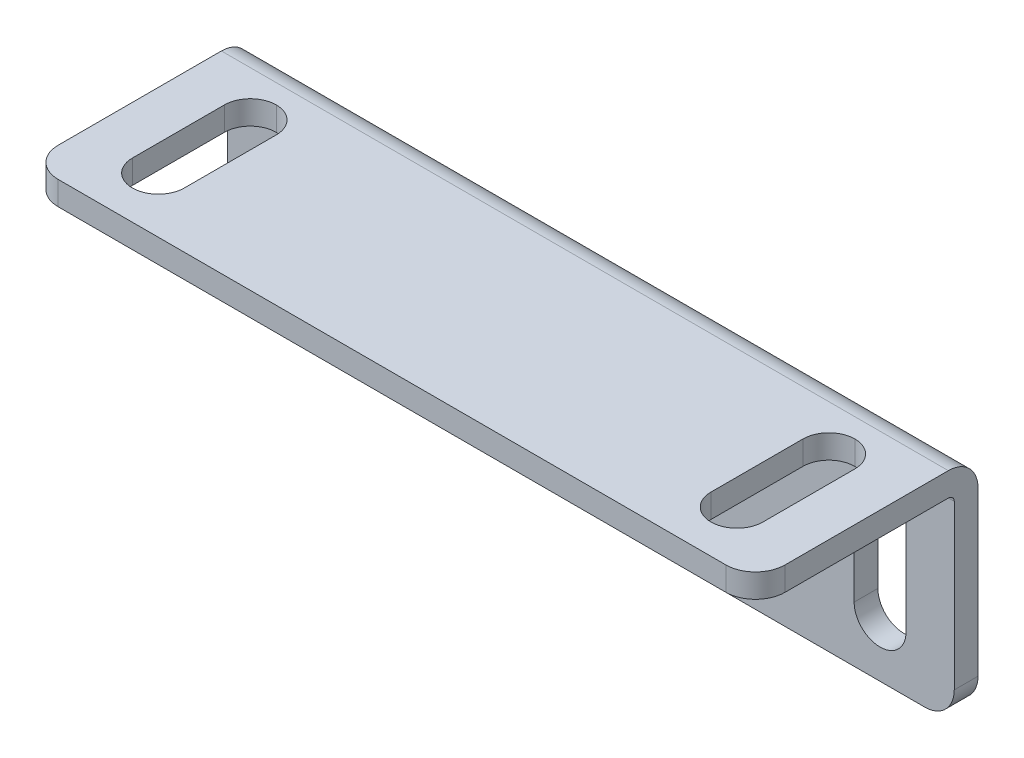
ISO-10303-21;
HEADER;
FILE_DESCRIPTION(('STEP AP214'),'2;1');
FILE_NAME('part.step','',(''),(''),'','','');
FILE_SCHEMA(('AUTOMOTIVE_DESIGN { 1 0 10303 214 1 1 1 1 }'));
ENDSEC;
DATA;
#1=APPLICATION_CONTEXT('core data for automotive mechanical design processes');
#2=APPLICATION_PROTOCOL_DEFINITION('international standard','automotive_design',2000,#1);
#3=PRODUCT_CONTEXT('',#1,'mechanical');
#4=PRODUCT('Part','Part','',(#3));
#5=PRODUCT_RELATED_PRODUCT_CATEGORY('part','',(#4));
#6=PRODUCT_DEFINITION_FORMATION('','',#4);
#7=PRODUCT_DEFINITION_CONTEXT('part definition',#1,'design');
#8=PRODUCT_DEFINITION('design','',#6,#7);
#9=PRODUCT_DEFINITION_SHAPE('','',#8);
#10=(LENGTH_UNIT() NAMED_UNIT(*) SI_UNIT(.MILLI.,.METRE.));
#11=(NAMED_UNIT(*) PLANE_ANGLE_UNIT() SI_UNIT($,.RADIAN.));
#12=(NAMED_UNIT(*) SI_UNIT($,.STERADIAN.) SOLID_ANGLE_UNIT());
#13=UNCERTAINTY_MEASURE_WITH_UNIT(LENGTH_MEASURE(1.E-05),#10,'distance_accuracy_value','');
#14=(GEOMETRIC_REPRESENTATION_CONTEXT(3) GLOBAL_UNCERTAINTY_ASSIGNED_CONTEXT((#13)) GLOBAL_UNIT_ASSIGNED_CONTEXT((#10,
#11,#12)) REPRESENTATION_CONTEXT('',''));
#15=CARTESIAN_POINT('',(0.,0.,0.));
#16=DIRECTION('',(0.,0.,1.));
#17=DIRECTION('',(1.,0.,0.));
#18=AXIS2_PLACEMENT_3D('',#15,#16,#17);
#19=CARTESIAN_POINT('',(-19.5,7.5,5.05));
#20=DIRECTION('',(0.,-1.,0.));
#21=DIRECTION('',(0.,0.,-1.));
#22=AXIS2_PLACEMENT_3D('',#19,#20,#21);
#23=CYLINDRICAL_SURFACE('',#22,1.75000000000005);
#24=CARTESIAN_POINT('',(-19.5,7.5,5.05));
#25=DIRECTION('',(0.,-1.,0.));
#26=DIRECTION('',(0.,0.,-1.));
#27=AXIS2_PLACEMENT_3D('',#24,#25,#26);
#28=CIRCLE('',#27,1.75000000000005);
#29=CARTESIAN_POINT('',(-19.5,7.5,3.29999999999996));
#30=VERTEX_POINT('',#29);
#31=CARTESIAN_POINT('',(-17.75,7.5,5.05));
#32=VERTEX_POINT('',#31);
#33=EDGE_CURVE('E41',#30,#32,#28,.T.);
#34=ORIENTED_EDGE('',*,*,#33,.F.);
#35=DIRECTION('',(0.,-1.,0.));
#36=VECTOR('',#35,1.);
#37=CARTESIAN_POINT('',(-19.5,7.5,3.29999999999996));
#38=LINE('',#37,#36);
#39=CARTESIAN_POINT('',(-19.5,5.9,3.29999999999996));
#40=VERTEX_POINT('',#39);
#41=EDGE_CURVE('E11',#30,#40,#38,.T.);
#42=ORIENTED_EDGE('',*,*,#41,.T.);
#43=CARTESIAN_POINT('',(-19.5,5.9,5.05));
#44=DIRECTION('',(0.,-1.,0.));
#45=DIRECTION('',(0.,0.,-1.));
#46=AXIS2_PLACEMENT_3D('',#43,#44,#45);
#47=CIRCLE('',#46,1.75000000000005);
#48=CARTESIAN_POINT('',(-17.75,5.9,5.05));
#49=VERTEX_POINT('',#48);
#50=EDGE_CURVE('E27',#40,#49,#47,.T.);
#51=ORIENTED_EDGE('',*,*,#50,.T.);
#52=DIRECTION('',(0.,-1.,0.));
#53=VECTOR('',#52,1.);
#54=CARTESIAN_POINT('',(-17.75,7.5,5.05));
#55=LINE('',#54,#53);
#56=EDGE_CURVE('E452',#32,#49,#55,.T.);
#57=ORIENTED_EDGE('',*,*,#56,.F.);
#58=EDGE_LOOP('',(#34,#42,#51,#57));
#59=FACE_BOUND('',#58,.T.);
#60=ADVANCED_FACE('F16',(#59),#23,.F.);
#61=CARTESIAN_POINT('',(19.5,7.5,5.05));
#62=DIRECTION('',(0.,-1.,0.));
#63=DIRECTION('',(0.,0.,-1.));
#64=AXIS2_PLACEMENT_3D('',#61,#62,#63);
#65=CYLINDRICAL_SURFACE('',#64,1.75000000000005);
#66=CARTESIAN_POINT('',(19.5,7.5,5.05));
#67=DIRECTION('',(0.,-1.,0.));
#68=DIRECTION('',(0.,0.,1.));
#69=AXIS2_PLACEMENT_3D('',#66,#67,#68);
#70=CIRCLE('',#69,1.75000000000005);
#71=CARTESIAN_POINT('',(19.5,7.5,3.29999999999996));
#72=VERTEX_POINT('',#71);
#73=CARTESIAN_POINT('',(21.25,7.5,5.05));
#74=VERTEX_POINT('',#73);
#75=EDGE_CURVE('E290',#72,#74,#70,.T.);
#76=ORIENTED_EDGE('',*,*,#75,.F.);
#77=DIRECTION('',(0.,-1.,0.));
#78=VECTOR('',#77,1.);
#79=CARTESIAN_POINT('',(19.5,7.5,3.29999999999996));
#80=LINE('',#79,#78);
#81=CARTESIAN_POINT('',(19.5,5.9,3.29999999999996));
#82=VERTEX_POINT('',#81);
#83=EDGE_CURVE('E285',#72,#82,#80,.T.);
#84=ORIENTED_EDGE('',*,*,#83,.T.);
#85=CARTESIAN_POINT('',(19.5,5.9,5.05));
#86=DIRECTION('',(0.,-1.,0.));
#87=DIRECTION('',(0.,0.,1.));
#88=AXIS2_PLACEMENT_3D('',#85,#86,#87);
#89=CIRCLE('',#88,1.75000000000005);
#90=CARTESIAN_POINT('',(21.25,5.9,5.05));
#91=VERTEX_POINT('',#90);
#92=EDGE_CURVE('E492',#82,#91,#89,.T.);
#93=ORIENTED_EDGE('',*,*,#92,.T.);
#94=DIRECTION('',(0.,-1.,0.));
#95=VECTOR('',#94,1.);
#96=CARTESIAN_POINT('',(21.25,7.5,5.05));
#97=LINE('',#96,#95);
#98=EDGE_CURVE('E305',#74,#91,#97,.T.);
#99=ORIENTED_EDGE('',*,*,#98,.F.);
#100=EDGE_LOOP('',(#76,#84,#93,#99));
#101=FACE_BOUND('',#100,.T.);
#102=ADVANCED_FACE('F637',(#101),#65,.F.);
#103=CARTESIAN_POINT('',(0.,0.,1.6));
#104=DIRECTION('',(0.,0.,-1.));
#105=DIRECTION('',(0.,-1.,0.));
#106=AXIS2_PLACEMENT_3D('',#103,#104,#105);
#107=PLANE('',#106);
#108=DIRECTION('',(0.,-1.,0.));
#109=VECTOR('',#108,1.);
#110=CARTESIAN_POINT('',(-24.5,-7.5,1.6));
#111=LINE('',#110,#109);
#112=CARTESIAN_POINT('',(-24.5,5.5,1.6));
#113=VERTEX_POINT('',#112);
#114=CARTESIAN_POINT('',(-24.5,-5.5,1.6));
#115=VERTEX_POINT('',#114);
#116=EDGE_CURVE('E341',#113,#115,#111,.T.);
#117=ORIENTED_EDGE('',*,*,#116,.T.);
#118=CARTESIAN_POINT('',(-22.5,-5.5,1.6));
#119=DIRECTION('',(0.,0.,1.));
#120=DIRECTION('',(-1.,0.,0.));
#121=AXIS2_PLACEMENT_3D('',#118,#119,#120);
#122=CIRCLE('',#121,2.);
#123=CARTESIAN_POINT('',(-22.5,-7.5,1.6));
#124=VERTEX_POINT('',#123);
#125=EDGE_CURVE('E337',#115,#124,#122,.T.);
#126=ORIENTED_EDGE('',*,*,#125,.T.);
#127=DIRECTION('',(1.,0.,0.));
#128=VECTOR('',#127,1.);
#129=CARTESIAN_POINT('',(-24.5,-7.5,1.6));
#130=LINE('',#129,#128);
#131=CARTESIAN_POINT('',(22.5,-7.5,1.6));
#132=VERTEX_POINT('',#131);
#133=EDGE_CURVE('E342',#124,#132,#130,.T.);
#134=ORIENTED_EDGE('',*,*,#133,.T.);
#135=CARTESIAN_POINT('',(22.5,-5.5,1.6));
#136=DIRECTION('',(0.,0.,1.));
#137=DIRECTION('',(-1.,0.,0.));
#138=AXIS2_PLACEMENT_3D('',#135,#136,#137);
#139=CIRCLE('',#138,2.);
#140=CARTESIAN_POINT('',(24.5,-5.5,1.6));
#141=VERTEX_POINT('',#140);
#142=EDGE_CURVE('E443',#132,#141,#139,.T.);
#143=ORIENTED_EDGE('',*,*,#142,.T.);
#144=DIRECTION('',(0.,1.,0.));
#145=VECTOR('',#144,1.);
#146=CARTESIAN_POINT('',(24.5,-7.5,1.6));
#147=LINE('',#146,#145);
#148=CARTESIAN_POINT('',(24.5,5.5,1.6));
#149=VERTEX_POINT('',#148);
#150=EDGE_CURVE('E447',#141,#149,#147,.T.);
#151=ORIENTED_EDGE('',*,*,#150,.T.);
#152=DIRECTION('',(-1.,0.,0.));
#153=VECTOR('',#152,1.);
#154=CARTESIAN_POINT('',(-24.5,5.5,1.6));
#155=LINE('',#154,#153);
#156=EDGE_CURVE('E451',#149,#113,#155,.T.);
#157=ORIENTED_EDGE('',*,*,#156,.T.);
#158=EDGE_LOOP('',(#117,#126,#134,#143,#151,#157));
#159=FACE_BOUND('',#158,.T.);
#160=DIRECTION('',(0.,-1.,0.));
#161=VECTOR('',#160,1.);
#162=CARTESIAN_POINT('',(-21.25,2.45,1.6));
#163=LINE('',#162,#161);
#164=CARTESIAN_POINT('',(-21.25,2.45,1.6));
#165=VERTEX_POINT('',#164);
#166=CARTESIAN_POINT('',(-21.25,-3.75,1.6));
#167=VERTEX_POINT('',#166);
#168=EDGE_CURVE('E367',#165,#167,#163,.T.);
#169=ORIENTED_EDGE('',*,*,#168,.F.);
#170=CARTESIAN_POINT('',(-19.5,2.45,1.6));
#171=DIRECTION('',(0.,0.,1.));
#172=DIRECTION('',(1.,0.,0.));
#173=AXIS2_PLACEMENT_3D('',#170,#171,#172);
#174=CIRCLE('',#173,1.75);
#175=CARTESIAN_POINT('',(-17.75,2.45,1.6));
#176=VERTEX_POINT('',#175);
#177=EDGE_CURVE('E330',#176,#165,#174,.T.);
#178=ORIENTED_EDGE('',*,*,#177,.F.);
#179=DIRECTION('',(0.,1.,0.));
#180=VECTOR('',#179,1.);
#181=CARTESIAN_POINT('',(-17.75,2.45,1.6));
#182=LINE('',#181,#180);
#183=CARTESIAN_POINT('',(-17.75,-3.75,1.6));
#184=VERTEX_POINT('',#183);
#185=EDGE_CURVE('E362',#184,#176,#182,.T.);
#186=ORIENTED_EDGE('',*,*,#185,.F.);
#187=CARTESIAN_POINT('',(-19.5,-3.75,1.6));
#188=DIRECTION('',(0.,0.,1.));
#189=DIRECTION('',(1.,0.,0.));
#190=AXIS2_PLACEMENT_3D('',#187,#188,#189);
#191=CIRCLE('',#190,1.75);
#192=EDGE_CURVE('E468',#167,#184,#191,.T.);
#193=ORIENTED_EDGE('',*,*,#192,.F.);
#194=EDGE_LOOP('',(#169,#178,#186,#193));
#195=FACE_BOUND('',#194,.T.);
#196=DIRECTION('',(0.,-1.,0.));
#197=VECTOR('',#196,1.);
#198=CARTESIAN_POINT('',(17.75,2.45,1.6));
#199=LINE('',#198,#197);
#200=CARTESIAN_POINT('',(17.75,2.45,1.6));
#201=VERTEX_POINT('',#200);
#202=CARTESIAN_POINT('',(17.75,-3.75000000000016,1.6));
#203=VERTEX_POINT('',#202);
#204=EDGE_CURVE('E329',#201,#203,#199,.T.);
#205=ORIENTED_EDGE('',*,*,#204,.F.);
#206=CARTESIAN_POINT('',(19.5,2.45,1.6));
#207=DIRECTION('',(0.,0.,1.));
#208=DIRECTION('',(-1.,0.,0.));
#209=AXIS2_PLACEMENT_3D('',#206,#207,#208);
#210=CIRCLE('',#209,1.75);
#211=CARTESIAN_POINT('',(21.25,2.45,1.6));
#212=VERTEX_POINT('',#211);
#213=EDGE_CURVE('E413',#212,#201,#210,.T.);
#214=ORIENTED_EDGE('',*,*,#213,.F.);
#215=DIRECTION('',(0.,1.,0.));
#216=VECTOR('',#215,1.);
#217=CARTESIAN_POINT('',(21.25,2.45,1.6));
#218=LINE('',#217,#216);
#219=CARTESIAN_POINT('',(21.25,-3.75000000000019,1.6));
#220=VERTEX_POINT('',#219);
#221=EDGE_CURVE('E403',#220,#212,#218,.T.);
#222=ORIENTED_EDGE('',*,*,#221,.F.);
#223=CARTESIAN_POINT('',(19.5,-3.75000000000018,1.6));
#224=DIRECTION('',(0.,0.,1.));
#225=DIRECTION('',(-1.,0.,0.));
#226=AXIS2_PLACEMENT_3D('',#223,#224,#225);
#227=CIRCLE('',#226,1.75);
#228=EDGE_CURVE('E383',#203,#220,#227,.T.);
#229=ORIENTED_EDGE('',*,*,#228,.F.);
#230=EDGE_LOOP('',(#205,#214,#222,#229));
#231=FACE_BOUND('',#230,.T.);
#232=ADVANCED_FACE('F613',(#159,#195,#231),#107,.F.);
#233=CARTESIAN_POINT('',(24.5,-7.5,1.6));
#234=DIRECTION('',(-1.,0.,0.));
#235=DIRECTION('',(0.,0.,1.));
#236=AXIS2_PLACEMENT_3D('',#233,#234,#235);
#237=PLANE('',#236);
#238=DIRECTION('',(0.,0.,-1.));
#239=VECTOR('',#238,1.);
#240=CARTESIAN_POINT('',(24.5,7.5,1.6));
#241=LINE('',#240,#239);
#242=CARTESIAN_POINT('',(24.5,7.5,13.));
#243=VERTEX_POINT('',#242);
#244=CARTESIAN_POINT('',(24.5,7.5,2.));
#245=VERTEX_POINT('',#244);
#246=EDGE_CURVE('E352',#243,#245,#241,.T.);
#247=ORIENTED_EDGE('',*,*,#246,.F.);
#248=DIRECTION('',(0.,-1.,0.));
#249=VECTOR('',#248,1.);
#250=CARTESIAN_POINT('',(24.5,5.9,13.));
#251=LINE('',#250,#249);
#252=CARTESIAN_POINT('',(24.5,5.9,13.));
#253=VERTEX_POINT('',#252);
#254=EDGE_CURVE('E499',#243,#253,#251,.T.);
#255=ORIENTED_EDGE('',*,*,#254,.T.);
#256=DIRECTION('',(0.,0.,-1.));
#257=VECTOR('',#256,1.);
#258=CARTESIAN_POINT('',(24.5,5.9,0.));
#259=LINE('',#258,#257);
#260=CARTESIAN_POINT('',(24.5,5.9,2.));
#261=VERTEX_POINT('',#260);
#262=EDGE_CURVE('E335',#253,#261,#259,.T.);
#263=ORIENTED_EDGE('',*,*,#262,.T.);
#264=CARTESIAN_POINT('',(24.5,5.5,2.));
#265=DIRECTION('',(-1.,0.,0.));
#266=DIRECTION('',(0.,0.,1.));
#267=AXIS2_PLACEMENT_3D('',#264,#265,#266);
#268=CIRCLE('',#267,0.4);
#269=EDGE_CURVE('E331',#261,#149,#268,.T.);
#270=ORIENTED_EDGE('',*,*,#269,.T.);
#271=ORIENTED_EDGE('',*,*,#150,.F.);
#272=DIRECTION('',(0.,0.,-1.));
#273=VECTOR('',#272,1.);
#274=CARTESIAN_POINT('',(24.5,-5.5,1.6));
#275=LINE('',#274,#273);
#276=CARTESIAN_POINT('',(24.5,-5.5,0.));
#277=VERTEX_POINT('',#276);
#278=EDGE_CURVE('E336',#141,#277,#275,.T.);
#279=ORIENTED_EDGE('',*,*,#278,.T.);
#280=DIRECTION('',(0.,1.,0.));
#281=VECTOR('',#280,1.);
#282=CARTESIAN_POINT('',(24.5,-7.5,0.));
#283=LINE('',#282,#281);
#284=CARTESIAN_POINT('',(24.5,5.5,0.));
#285=VERTEX_POINT('',#284);
#286=EDGE_CURVE('E346',#277,#285,#283,.T.);
#287=ORIENTED_EDGE('',*,*,#286,.T.);
#288=CARTESIAN_POINT('',(24.5,5.5,2.));
#289=DIRECTION('',(1.,0.,0.));
#290=DIRECTION('',(0.,0.,1.));
#291=AXIS2_PLACEMENT_3D('',#288,#289,#290);
#292=CIRCLE('',#291,2.);
#293=EDGE_CURVE('E387',#285,#245,#292,.T.);
#294=ORIENTED_EDGE('',*,*,#293,.T.);
#295=EDGE_LOOP('',(#247,#255,#263,#270,#271,#279,#287,#294));
#296=FACE_BOUND('',#295,.T.);
#297=ADVANCED_FACE('F670',(#296),#237,.F.);
#298=CARTESIAN_POINT('',(-24.5,7.5,1.6));
#299=DIRECTION('',(0.,-1.,0.));
#300=DIRECTION('',(0.,0.,-1.));
#301=AXIS2_PLACEMENT_3D('',#298,#299,#300);
#302=PLANE('',#301);
#303=DIRECTION('',(1.,0.,0.));
#304=VECTOR('',#303,1.);
#305=CARTESIAN_POINT('',(-24.5,7.5,15.));
#306=LINE('',#305,#304);
#307=CARTESIAN_POINT('',(-22.5,7.5,15.));
#308=VERTEX_POINT('',#307);
#309=CARTESIAN_POINT('',(22.5,7.5,15.));
#310=VERTEX_POINT('',#309);
#311=EDGE_CURVE('E351',#308,#310,#306,.T.);
#312=ORIENTED_EDGE('',*,*,#311,.T.);
#313=CARTESIAN_POINT('',(22.5,7.5,13.));
#314=DIRECTION('',(0.,1.,0.));
#315=DIRECTION('',(0.,0.,-1.));
#316=AXIS2_PLACEMENT_3D('',#313,#314,#315);
#317=CIRCLE('',#316,2.);
#318=EDGE_CURVE('E347',#310,#243,#317,.T.);
#319=ORIENTED_EDGE('',*,*,#318,.T.);
#320=ORIENTED_EDGE('',*,*,#246,.T.);
#321=DIRECTION('',(-1.,0.,0.));
#322=VECTOR('',#321,1.);
#323=CARTESIAN_POINT('',(-24.5,7.5,2.));
#324=LINE('',#323,#322);
#325=CARTESIAN_POINT('',(-24.5,7.5,2.));
#326=VERTEX_POINT('',#325);
#327=EDGE_CURVE('E361',#245,#326,#324,.T.);
#328=ORIENTED_EDGE('',*,*,#327,.T.);
#329=DIRECTION('',(0.,0.,-1.));
#330=VECTOR('',#329,1.);
#331=CARTESIAN_POINT('',(-24.5,7.5,1.6));
#332=LINE('',#331,#330);
#333=CARTESIAN_POINT('',(-24.5,7.5,13.));
#334=VERTEX_POINT('',#333);
#335=EDGE_CURVE('E496',#334,#326,#332,.T.);
#336=ORIENTED_EDGE('',*,*,#335,.F.);
#337=CARTESIAN_POINT('',(-22.5,7.5,13.));
#338=DIRECTION('',(0.,1.,0.));
#339=DIRECTION('',(0.,0.,-1.));
#340=AXIS2_PLACEMENT_3D('',#337,#338,#339);
#341=CIRCLE('',#340,2.);
#342=EDGE_CURVE('E461',#334,#308,#341,.T.);
#343=ORIENTED_EDGE('',*,*,#342,.T.);
#344=EDGE_LOOP('',(#312,#319,#320,#328,#336,#343));
#345=FACE_BOUND('',#344,.T.);
#346=DIRECTION('',(0.,0.,1.));
#347=VECTOR('',#346,1.);
#348=CARTESIAN_POINT('',(-17.75,7.5,11.25));
#349=LINE('',#348,#347);
#350=CARTESIAN_POINT('',(-17.75,7.5,11.25));
#351=VERTEX_POINT('',#350);
#352=EDGE_CURVE('E457',#32,#351,#349,.T.);
#353=ORIENTED_EDGE('',*,*,#352,.T.);
#354=CARTESIAN_POINT('',(-19.5,7.5,11.25));
#355=DIRECTION('',(0.,-1.,0.));
#356=DIRECTION('',(0.,0.,-1.));
#357=AXIS2_PLACEMENT_3D('',#354,#355,#356);
#358=CIRCLE('',#357,1.75);
#359=CARTESIAN_POINT('',(-21.25,7.5,11.25));
#360=VERTEX_POINT('',#359);
#361=EDGE_CURVE('E357',#351,#360,#358,.T.);
#362=ORIENTED_EDGE('',*,*,#361,.T.);
#363=DIRECTION('',(0.,0.,-1.));
#364=VECTOR('',#363,1.);
#365=CARTESIAN_POINT('',(-21.25,7.5,11.25));
#366=LINE('',#365,#364);
#367=CARTESIAN_POINT('',(-21.25,7.5,5.05));
#368=VERTEX_POINT('',#367);
#369=EDGE_CURVE('E353',#360,#368,#366,.T.);
#370=ORIENTED_EDGE('',*,*,#369,.T.);
#371=CARTESIAN_POINT('',(-19.5,7.5,5.05));
#372=DIRECTION('',(0.,-1.,0.));
#373=DIRECTION('',(0.,0.,-1.));
#374=AXIS2_PLACEMENT_3D('',#371,#372,#373);
#375=CIRCLE('',#374,1.75000000000005);
#376=EDGE_CURVE('E358',#368,#30,#375,.T.);
#377=ORIENTED_EDGE('',*,*,#376,.T.);
#378=ORIENTED_EDGE('',*,*,#33,.T.);
#379=EDGE_LOOP('',(#353,#362,#370,#377,#378));
#380=FACE_BOUND('',#379,.T.);
#381=DIRECTION('',(0.,0.,1.));
#382=VECTOR('',#381,1.);
#383=CARTESIAN_POINT('',(21.25,7.5,11.25));
#384=LINE('',#383,#382);
#385=CARTESIAN_POINT('',(21.25,7.5,11.25));
#386=VERTEX_POINT('',#385);
#387=EDGE_CURVE('E557',#74,#386,#384,.T.);
#388=ORIENTED_EDGE('',*,*,#387,.T.);
#389=CARTESIAN_POINT('',(19.5,7.5,11.25));
#390=DIRECTION('',(0.,-1.,0.));
#391=DIRECTION('',(0.,0.,1.));
#392=AXIS2_PLACEMENT_3D('',#389,#390,#391);
#393=CIRCLE('',#392,1.75);
#394=CARTESIAN_POINT('',(17.75,7.5,11.25));
#395=VERTEX_POINT('',#394);
#396=EDGE_CURVE('E295',#386,#395,#393,.T.);
#397=ORIENTED_EDGE('',*,*,#396,.T.);
#398=DIRECTION('',(0.,0.,-1.));
#399=VECTOR('',#398,1.);
#400=CARTESIAN_POINT('',(17.75,7.5,11.25));
#401=LINE('',#400,#399);
#402=CARTESIAN_POINT('',(17.75,7.5,5.05));
#403=VERTEX_POINT('',#402);
#404=EDGE_CURVE('E289',#395,#403,#401,.T.);
#405=ORIENTED_EDGE('',*,*,#404,.T.);
#406=CARTESIAN_POINT('',(19.5,7.5,5.05));
#407=DIRECTION('',(0.,-1.,0.));
#408=DIRECTION('',(0.,0.,1.));
#409=AXIS2_PLACEMENT_3D('',#406,#407,#408);
#410=CIRCLE('',#409,1.75000000000005);
#411=EDGE_CURVE('E278',#403,#72,#410,.T.);
#412=ORIENTED_EDGE('',*,*,#411,.T.);
#413=ORIENTED_EDGE('',*,*,#75,.T.);
#414=EDGE_LOOP('',(#388,#397,#405,#412,#413));
#415=FACE_BOUND('',#414,.T.);
#416=ADVANCED_FACE('F294',(#345,#380,#415),#302,.F.);
#417=CARTESIAN_POINT('',(-24.5,-7.5,1.6));
#418=DIRECTION('',(1.,0.,0.));
#419=DIRECTION('',(0.,1.,0.));
#420=AXIS2_PLACEMENT_3D('',#417,#418,#419);
#421=PLANE('',#420);
#422=DIRECTION('',(0.,0.,1.));
#423=VECTOR('',#422,1.);
#424=CARTESIAN_POINT('',(-24.5,5.9,0.));
#425=LINE('',#424,#423);
#426=CARTESIAN_POINT('',(-24.5,5.9,2.));
#427=VERTEX_POINT('',#426);
#428=CARTESIAN_POINT('',(-24.5,5.9,13.));
#429=VERTEX_POINT('',#428);
#430=EDGE_CURVE('E418',#427,#429,#425,.T.);
#431=ORIENTED_EDGE('',*,*,#430,.T.);
#432=DIRECTION('',(0.,1.,0.));
#433=VECTOR('',#432,1.);
#434=CARTESIAN_POINT('',(-24.5,7.5,13.));
#435=LINE('',#434,#433);
#436=EDGE_CURVE('E422',#429,#334,#435,.T.);
#437=ORIENTED_EDGE('',*,*,#436,.T.);
#438=ORIENTED_EDGE('',*,*,#335,.T.);
#439=CARTESIAN_POINT('',(-24.5,5.5,2.));
#440=DIRECTION('',(-1.,0.,0.));
#441=DIRECTION('',(0.,0.,-1.));
#442=AXIS2_PLACEMENT_3D('',#439,#440,#441);
#443=CIRCLE('',#442,2.);
#444=CARTESIAN_POINT('',(-24.5,5.5,0.));
#445=VERTEX_POINT('',#444);
#446=EDGE_CURVE('E441',#326,#445,#443,.T.);
#447=ORIENTED_EDGE('',*,*,#446,.T.);
#448=DIRECTION('',(0.,-1.,0.));
#449=VECTOR('',#448,1.);
#450=CARTESIAN_POINT('',(-24.5,-7.5,0.));
#451=LINE('',#450,#449);
#452=CARTESIAN_POINT('',(-24.5,-5.5,0.));
#453=VERTEX_POINT('',#452);
#454=EDGE_CURVE('E397',#445,#453,#451,.T.);
#455=ORIENTED_EDGE('',*,*,#454,.T.);
#456=DIRECTION('',(0.,0.,1.));
#457=VECTOR('',#456,1.);
#458=CARTESIAN_POINT('',(-24.5,-5.5,1.6));
#459=LINE('',#458,#457);
#460=EDGE_CURVE('E393',#453,#115,#459,.T.);
#461=ORIENTED_EDGE('',*,*,#460,.T.);
#462=ORIENTED_EDGE('',*,*,#116,.F.);
#463=CARTESIAN_POINT('',(-24.5,5.5,2.));
#464=DIRECTION('',(1.,0.,0.));
#465=DIRECTION('',(0.,0.,-1.));
#466=AXIS2_PLACEMENT_3D('',#463,#464,#465);
#467=CIRCLE('',#466,0.4);
#468=EDGE_CURVE('E398',#113,#427,#467,.T.);
#469=ORIENTED_EDGE('',*,*,#468,.T.);
#470=EDGE_LOOP('',(#431,#437,#438,#447,#455,#461,#462,#469));
#471=FACE_BOUND('',#470,.T.);
#472=ADVANCED_FACE('F668',(#471),#421,.F.);
#473=CARTESIAN_POINT('',(-24.5,-7.5,1.6));
#474=DIRECTION('',(0.,1.,0.));
#475=DIRECTION('',(1.,0.,0.));
#476=AXIS2_PLACEMENT_3D('',#473,#474,#475);
#477=PLANE('',#476);
#478=ORIENTED_EDGE('',*,*,#133,.F.);
#479=DIRECTION('',(0.,0.,-1.));
#480=VECTOR('',#479,1.);
#481=CARTESIAN_POINT('',(-22.5,-7.5,1.6));
#482=LINE('',#481,#480);
#483=CARTESIAN_POINT('',(-22.5,-7.5,0.));
#484=VERTEX_POINT('',#483);
#485=EDGE_CURVE('E402',#124,#484,#482,.T.);
#486=ORIENTED_EDGE('',*,*,#485,.T.);
#487=DIRECTION('',(1.,0.,0.));
#488=VECTOR('',#487,1.);
#489=CARTESIAN_POINT('',(-24.5,-7.5,0.));
#490=LINE('',#489,#488);
#491=CARTESIAN_POINT('',(22.5,-7.5,0.));
#492=VERTEX_POINT('',#491);
#493=EDGE_CURVE('E375',#484,#492,#490,.T.);
#494=ORIENTED_EDGE('',*,*,#493,.T.);
#495=DIRECTION('',(0.,0.,1.));
#496=VECTOR('',#495,1.);
#497=CARTESIAN_POINT('',(22.5,-7.5,1.6));
#498=LINE('',#497,#496);
#499=EDGE_CURVE('E371',#492,#132,#498,.T.);
#500=ORIENTED_EDGE('',*,*,#499,.T.);
#501=EDGE_LOOP('',(#478,#486,#494,#500));
#502=FACE_BOUND('',#501,.T.);
#503=ADVANCED_FACE('F665',(#502),#477,.F.);
#504=CARTESIAN_POINT('',(0.,0.,0.));
#505=DIRECTION('',(0.,0.,-1.));
#506=DIRECTION('',(0.,-1.,0.));
#507=AXIS2_PLACEMENT_3D('',#504,#505,#506);
#508=PLANE('',#507);
#509=ORIENTED_EDGE('',*,*,#493,.F.);
#510=CARTESIAN_POINT('',(-22.5,-5.5,0.));
#511=DIRECTION('',(0.,0.,-1.));
#512=DIRECTION('',(-1.,0.,0.));
#513=AXIS2_PLACEMENT_3D('',#510,#511,#512);
#514=CIRCLE('',#513,2.);
#515=EDGE_CURVE('E323',#484,#453,#514,.T.);
#516=ORIENTED_EDGE('',*,*,#515,.T.);
#517=ORIENTED_EDGE('',*,*,#454,.F.);
#518=DIRECTION('',(1.,0.,0.));
#519=VECTOR('',#518,1.);
#520=CARTESIAN_POINT('',(24.5,5.5,0.));
#521=LINE('',#520,#519);
#522=EDGE_CURVE('E319',#445,#285,#521,.T.);
#523=ORIENTED_EDGE('',*,*,#522,.T.);
#524=ORIENTED_EDGE('',*,*,#286,.F.);
#525=CARTESIAN_POINT('',(22.5,-5.5,0.));
#526=DIRECTION('',(0.,0.,-1.));
#527=DIRECTION('',(-1.,0.,0.));
#528=AXIS2_PLACEMENT_3D('',#525,#526,#527);
#529=CIRCLE('',#528,2.);
#530=EDGE_CURVE('E324',#277,#492,#529,.T.);
#531=ORIENTED_EDGE('',*,*,#530,.T.);
#532=EDGE_LOOP('',(#509,#516,#517,#523,#524,#531));
#533=FACE_BOUND('',#532,.T.);
#534=CARTESIAN_POINT('',(-19.5,2.45,0.));
#535=DIRECTION('',(0.,0.,1.));
#536=DIRECTION('',(1.,0.,0.));
#537=AXIS2_PLACEMENT_3D('',#534,#535,#536);
#538=CIRCLE('',#537,1.75);
#539=CARTESIAN_POINT('',(-17.75,2.45,0.));
#540=VERTEX_POINT('',#539);
#541=CARTESIAN_POINT('',(-21.25,2.45,0.));
#542=VERTEX_POINT('',#541);
#543=EDGE_CURVE('E388',#540,#542,#538,.T.);
#544=ORIENTED_EDGE('',*,*,#543,.T.);
#545=DIRECTION('',(0.,-1.,0.));
#546=VECTOR('',#545,1.);
#547=CARTESIAN_POINT('',(-21.25,2.45,0.));
#548=LINE('',#547,#546);
#549=CARTESIAN_POINT('',(-21.25,-3.75,0.));
#550=VERTEX_POINT('',#549);
#551=EDGE_CURVE('E392',#542,#550,#548,.T.);
#552=ORIENTED_EDGE('',*,*,#551,.T.);
#553=CARTESIAN_POINT('',(-19.5,-3.75,0.));
#554=DIRECTION('',(0.,0.,1.));
#555=DIRECTION('',(1.,0.,0.));
#556=AXIS2_PLACEMENT_3D('',#553,#554,#555);
#557=CIRCLE('',#556,1.75);
#558=CARTESIAN_POINT('',(-17.75,-3.75,0.));
#559=VERTEX_POINT('',#558);
#560=EDGE_CURVE('E411',#550,#559,#557,.T.);
#561=ORIENTED_EDGE('',*,*,#560,.T.);
#562=DIRECTION('',(0.,1.,0.));
#563=VECTOR('',#562,1.);
#564=CARTESIAN_POINT('',(-17.75,2.45,0.));
#565=LINE('',#564,#563);
#566=EDGE_CURVE('E408',#559,#540,#565,.T.);
#567=ORIENTED_EDGE('',*,*,#566,.T.);
#568=EDGE_LOOP('',(#544,#552,#561,#567));
#569=FACE_BOUND('',#568,.T.);
#570=CARTESIAN_POINT('',(19.5,2.45,0.));
#571=DIRECTION('',(0.,0.,1.));
#572=DIRECTION('',(-1.,0.,0.));
#573=AXIS2_PLACEMENT_3D('',#570,#571,#572);
#574=CIRCLE('',#573,1.75);
#575=CARTESIAN_POINT('',(21.25,2.45,0.));
#576=VERTEX_POINT('',#575);
#577=CARTESIAN_POINT('',(17.75,2.45,0.));
#578=VERTEX_POINT('',#577);
#579=EDGE_CURVE('E412',#576,#578,#574,.T.);
#580=ORIENTED_EDGE('',*,*,#579,.T.);
#581=DIRECTION('',(0.,-1.,0.));
#582=VECTOR('',#581,1.);
#583=CARTESIAN_POINT('',(17.75,2.45,0.));
#584=LINE('',#583,#582);
#585=CARTESIAN_POINT('',(17.75,-3.75000000000016,0.));
#586=VERTEX_POINT('',#585);
#587=EDGE_CURVE('E427',#578,#586,#584,.T.);
#588=ORIENTED_EDGE('',*,*,#587,.T.);
#589=CARTESIAN_POINT('',(19.5,-3.75000000000018,0.));
#590=DIRECTION('',(0.,0.,1.));
#591=DIRECTION('',(-1.,0.,0.));
#592=AXIS2_PLACEMENT_3D('',#589,#590,#591);
#593=CIRCLE('',#592,1.75);
#594=CARTESIAN_POINT('',(21.25,-3.75000000000019,0.));
#595=VERTEX_POINT('',#594);
#596=EDGE_CURVE('E423',#586,#595,#593,.T.);
#597=ORIENTED_EDGE('',*,*,#596,.T.);
#598=DIRECTION('',(0.,1.,0.));
#599=VECTOR('',#598,1.);
#600=CARTESIAN_POINT('',(21.25,2.45,0.));
#601=LINE('',#600,#599);
#602=EDGE_CURVE('E428',#595,#576,#601,.T.);
#603=ORIENTED_EDGE('',*,*,#602,.T.);
#604=EDGE_LOOP('',(#580,#588,#597,#603));
#605=FACE_BOUND('',#604,.T.);
#606=ADVANCED_FACE('F619',(#533,#569,#605),#508,.T.);
#607=CARTESIAN_POINT('',(0.,5.9,0.));
#608=DIRECTION('',(0.,1.,0.));
#609=DIRECTION('',(1.,0.,0.));
#610=AXIS2_PLACEMENT_3D('',#607,#608,#609);
#611=PLANE('',#610);
#612=ORIENTED_EDGE('',*,*,#262,.F.);
#613=CARTESIAN_POINT('',(22.5,5.9,13.));
#614=DIRECTION('',(0.,-1.,0.));
#615=DIRECTION('',(0.,0.,1.));
#616=AXIS2_PLACEMENT_3D('',#613,#614,#615);
#617=CIRCLE('',#616,2.);
#618=CARTESIAN_POINT('',(22.5,5.9,15.));
#619=VERTEX_POINT('',#618);
#620=EDGE_CURVE('E475',#253,#619,#617,.T.);
#621=ORIENTED_EDGE('',*,*,#620,.T.);
#622=DIRECTION('',(1.,0.,0.));
#623=VECTOR('',#622,1.);
#624=CARTESIAN_POINT('',(-24.5,5.9,15.));
#625=LINE('',#624,#623);
#626=CARTESIAN_POINT('',(-22.5,5.9,15.));
#627=VERTEX_POINT('',#626);
#628=EDGE_CURVE('E485',#627,#619,#625,.T.);
#629=ORIENTED_EDGE('',*,*,#628,.F.);
#630=CARTESIAN_POINT('',(-22.5,5.9,13.));
#631=DIRECTION('',(0.,-1.,0.));
#632=DIRECTION('',(0.,0.,1.));
#633=AXIS2_PLACEMENT_3D('',#630,#631,#632);
#634=CIRCLE('',#633,2.);
#635=EDGE_CURVE('E472',#627,#429,#634,.T.);
#636=ORIENTED_EDGE('',*,*,#635,.T.);
#637=ORIENTED_EDGE('',*,*,#430,.F.);
#638=DIRECTION('',(1.,0.,0.));
#639=VECTOR('',#638,1.);
#640=CARTESIAN_POINT('',(24.5,5.9,2.));
#641=LINE('',#640,#639);
#642=EDGE_CURVE('E476',#427,#261,#641,.T.);
#643=ORIENTED_EDGE('',*,*,#642,.T.);
#644=EDGE_LOOP('',(#612,#621,#629,#636,#637,#643));
#645=FACE_BOUND('',#644,.T.);
#646=DIRECTION('',(0.,0.,-1.));
#647=VECTOR('',#646,1.);
#648=CARTESIAN_POINT('',(-21.25,5.9,11.25));
#649=LINE('',#648,#647);
#650=CARTESIAN_POINT('',(-21.25,5.9,11.25));
#651=VERTEX_POINT('',#650);
#652=CARTESIAN_POINT('',(-21.25,5.9,5.05));
#653=VERTEX_POINT('',#652);
#654=EDGE_CURVE('E517',#651,#653,#649,.T.);
#655=ORIENTED_EDGE('',*,*,#654,.F.);
#656=CARTESIAN_POINT('',(-19.5,5.9,11.25));
#657=DIRECTION('',(0.,-1.,0.));
#658=DIRECTION('',(0.,0.,-1.));
#659=AXIS2_PLACEMENT_3D('',#656,#657,#658);
#660=CIRCLE('',#659,1.75);
#661=CARTESIAN_POINT('',(-17.75,5.9,11.25));
#662=VERTEX_POINT('',#661);
#663=EDGE_CURVE('E435',#662,#651,#660,.T.);
#664=ORIENTED_EDGE('',*,*,#663,.F.);
#665=DIRECTION('',(0.,0.,1.));
#666=VECTOR('',#665,1.);
#667=CARTESIAN_POINT('',(-17.75,5.9,11.25));
#668=LINE('',#667,#666);
#669=EDGE_CURVE('E455',#49,#662,#668,.T.);
#670=ORIENTED_EDGE('',*,*,#669,.F.);
#671=ORIENTED_EDGE('',*,*,#50,.F.);
#672=CARTESIAN_POINT('',(-19.5,5.9,5.05));
#673=DIRECTION('',(0.,-1.,0.));
#674=DIRECTION('',(0.,0.,-1.));
#675=AXIS2_PLACEMENT_3D('',#672,#673,#674);
#676=CIRCLE('',#675,1.75000000000005);
#677=EDGE_CURVE('E513',#653,#40,#676,.T.);
#678=ORIENTED_EDGE('',*,*,#677,.F.);
#679=EDGE_LOOP('',(#655,#664,#670,#671,#678));
#680=FACE_BOUND('',#679,.T.);
#681=DIRECTION('',(0.,0.,-1.));
#682=VECTOR('',#681,1.);
#683=CARTESIAN_POINT('',(17.75,5.9,11.25));
#684=LINE('',#683,#682);
#685=CARTESIAN_POINT('',(17.75,5.9,11.25));
#686=VERTEX_POINT('',#685);
#687=CARTESIAN_POINT('',(17.75,5.9,5.05));
#688=VERTEX_POINT('',#687);
#689=EDGE_CURVE('E302',#686,#688,#684,.T.);
#690=ORIENTED_EDGE('',*,*,#689,.F.);
#691=CARTESIAN_POINT('',(19.5,5.9,11.25));
#692=DIRECTION('',(0.,-1.,0.));
#693=DIRECTION('',(0.,0.,1.));
#694=AXIS2_PLACEMENT_3D('',#691,#692,#693);
#695=CIRCLE('',#694,1.75);
#696=CARTESIAN_POINT('',(21.25,5.9,11.25));
#697=VERTEX_POINT('',#696);
#698=EDGE_CURVE('E509',#697,#686,#695,.T.);
#699=ORIENTED_EDGE('',*,*,#698,.F.);
#700=DIRECTION('',(0.,0.,1.));
#701=VECTOR('',#700,1.);
#702=CARTESIAN_POINT('',(21.25,5.9,11.25));
#703=LINE('',#702,#701);
#704=EDGE_CURVE('E313',#91,#697,#703,.T.);
#705=ORIENTED_EDGE('',*,*,#704,.F.);
#706=ORIENTED_EDGE('',*,*,#92,.F.);
#707=CARTESIAN_POINT('',(19.5,5.9,5.05));
#708=DIRECTION('',(0.,-1.,0.));
#709=DIRECTION('',(0.,0.,1.));
#710=AXIS2_PLACEMENT_3D('',#707,#708,#709);
#711=CIRCLE('',#710,1.75000000000005);
#712=EDGE_CURVE('E306',#688,#82,#711,.T.);
#713=ORIENTED_EDGE('',*,*,#712,.F.);
#714=EDGE_LOOP('',(#690,#699,#705,#706,#713));
#715=FACE_BOUND('',#714,.T.);
#716=ADVANCED_FACE('F685',(#645,#680,#715),#611,.F.);
#717=CARTESIAN_POINT('',(-24.5,5.9,15.));
#718=DIRECTION('',(0.,0.,1.));
#719=DIRECTION('',(1.,0.,0.));
#720=AXIS2_PLACEMENT_3D('',#717,#718,#719);
#721=PLANE('',#720);
#722=ORIENTED_EDGE('',*,*,#628,.T.);
#723=DIRECTION('',(0.,1.,0.));
#724=VECTOR('',#723,1.);
#725=CARTESIAN_POINT('',(22.5,7.5,15.));
#726=LINE('',#725,#724);
#727=EDGE_CURVE('E482',#619,#310,#726,.T.);
#728=ORIENTED_EDGE('',*,*,#727,.T.);
#729=ORIENTED_EDGE('',*,*,#311,.F.);
#730=DIRECTION('',(0.,-1.,0.));
#731=VECTOR('',#730,1.);
#732=CARTESIAN_POINT('',(-22.5,5.9,15.));
#733=LINE('',#732,#731);
#734=EDGE_CURVE('E417',#308,#627,#733,.T.);
#735=ORIENTED_EDGE('',*,*,#734,.T.);
#736=EDGE_LOOP('',(#722,#728,#729,#735));
#737=FACE_BOUND('',#736,.T.);
#738=ADVANCED_FACE('F18',(#737),#721,.T.);
#739=CARTESIAN_POINT('',(0.,5.5,2.));
#740=DIRECTION('',(-1.,0.,0.));
#741=DIRECTION('',(0.,0.,1.));
#742=AXIS2_PLACEMENT_3D('',#739,#740,#741);
#743=CYLINDRICAL_SURFACE('',#742,0.4);
#744=ORIENTED_EDGE('',*,*,#468,.F.);
#745=ORIENTED_EDGE('',*,*,#156,.F.);
#746=ORIENTED_EDGE('',*,*,#269,.F.);
#747=ORIENTED_EDGE('',*,*,#642,.F.);
#748=EDGE_LOOP('',(#744,#745,#746,#747));
#749=FACE_BOUND('',#748,.T.);
#750=ADVANCED_FACE('F1074',(#749),#743,.F.);
#751=CARTESIAN_POINT('',(-24.5,5.5,2.));
#752=DIRECTION('',(1.,0.,0.));
#753=DIRECTION('',(0.,0.,-1.));
#754=AXIS2_PLACEMENT_3D('',#751,#752,#753);
#755=CYLINDRICAL_SURFACE('',#754,2.);
#756=ORIENTED_EDGE('',*,*,#293,.F.);
#757=ORIENTED_EDGE('',*,*,#522,.F.);
#758=ORIENTED_EDGE('',*,*,#446,.F.);
#759=ORIENTED_EDGE('',*,*,#327,.F.);
#760=EDGE_LOOP('',(#756,#757,#758,#759));
#761=FACE_BOUND('',#760,.T.);
#762=ADVANCED_FACE('F647',(#761),#755,.T.);
#763=CARTESIAN_POINT('',(22.5,5.9,13.));
#764=DIRECTION('',(0.,-1.,0.));
#765=DIRECTION('',(0.,0.,-1.));
#766=AXIS2_PLACEMENT_3D('',#763,#764,#765);
#767=CYLINDRICAL_SURFACE('',#766,2.);
#768=ORIENTED_EDGE('',*,*,#620,.F.);
#769=ORIENTED_EDGE('',*,*,#254,.F.);
#770=ORIENTED_EDGE('',*,*,#318,.F.);
#771=ORIENTED_EDGE('',*,*,#727,.F.);
#772=EDGE_LOOP('',(#768,#769,#770,#771));
#773=FACE_BOUND('',#772,.T.);
#774=ADVANCED_FACE('F656',(#773),#767,.T.);
#775=CARTESIAN_POINT('',(-22.5,-7.5,13.));
#776=DIRECTION('',(0.,-1.,0.));
#777=DIRECTION('',(0.,0.,-1.));
#778=AXIS2_PLACEMENT_3D('',#775,#776,#777);
#779=CYLINDRICAL_SURFACE('',#778,2.);
#780=ORIENTED_EDGE('',*,*,#635,.F.);
#781=ORIENTED_EDGE('',*,*,#734,.F.);
#782=ORIENTED_EDGE('',*,*,#342,.F.);
#783=ORIENTED_EDGE('',*,*,#436,.F.);
#784=EDGE_LOOP('',(#780,#781,#782,#783));
#785=FACE_BOUND('',#784,.T.);
#786=ADVANCED_FACE('F659',(#785),#779,.T.);
#787=CARTESIAN_POINT('',(-22.5,-5.5,1.6));
#788=DIRECTION('',(0.,0.,-1.));
#789=DIRECTION('',(-1.,0.,0.));
#790=AXIS2_PLACEMENT_3D('',#787,#788,#789);
#791=CYLINDRICAL_SURFACE('',#790,2.);
#792=ORIENTED_EDGE('',*,*,#125,.F.);
#793=ORIENTED_EDGE('',*,*,#460,.F.);
#794=ORIENTED_EDGE('',*,*,#515,.F.);
#795=ORIENTED_EDGE('',*,*,#485,.F.);
#796=EDGE_LOOP('',(#792,#793,#794,#795));
#797=FACE_BOUND('',#796,.T.);
#798=ADVANCED_FACE('F679',(#797),#791,.T.);
#799=CARTESIAN_POINT('',(22.5,-5.5,1.6));
#800=DIRECTION('',(0.,0.,-1.));
#801=DIRECTION('',(-1.,0.,0.));
#802=AXIS2_PLACEMENT_3D('',#799,#800,#801);
#803=CYLINDRICAL_SURFACE('',#802,2.);
#804=ORIENTED_EDGE('',*,*,#142,.F.);
#805=ORIENTED_EDGE('',*,*,#499,.F.);
#806=ORIENTED_EDGE('',*,*,#530,.F.);
#807=ORIENTED_EDGE('',*,*,#278,.F.);
#808=EDGE_LOOP('',(#804,#805,#806,#807));
#809=FACE_BOUND('',#808,.T.);
#810=ADVANCED_FACE('F1081',(#809),#803,.T.);
#811=CARTESIAN_POINT('',(19.5,2.45,0.));
#812=DIRECTION('',(0.,0.,1.));
#813=DIRECTION('',(1.,0.,0.));
#814=AXIS2_PLACEMENT_3D('',#811,#812,#813);
#815=CYLINDRICAL_SURFACE('',#814,1.75);
#816=ORIENTED_EDGE('',*,*,#213,.T.);
#817=DIRECTION('',(0.,0.,1.));
#818=VECTOR('',#817,1.);
#819=CARTESIAN_POINT('',(17.75,2.45,0.));
#820=LINE('',#819,#818);
#821=EDGE_CURVE('E325',#578,#201,#820,.T.);
#822=ORIENTED_EDGE('',*,*,#821,.F.);
#823=ORIENTED_EDGE('',*,*,#579,.F.);
#824=DIRECTION('',(0.,0.,1.));
#825=VECTOR('',#824,1.);
#826=CARTESIAN_POINT('',(21.25,2.45,0.));
#827=LINE('',#826,#825);
#828=EDGE_CURVE('E406',#576,#212,#827,.T.);
#829=ORIENTED_EDGE('',*,*,#828,.T.);
#830=EDGE_LOOP('',(#816,#822,#823,#829));
#831=FACE_BOUND('',#830,.T.);
#832=ADVANCED_FACE('F617',(#831),#815,.F.);
#833=CARTESIAN_POINT('',(21.25,2.45,0.));
#834=DIRECTION('',(1.,0.,0.));
#835=DIRECTION('',(0.,-1.,0.));
#836=AXIS2_PLACEMENT_3D('',#833,#834,#835);
#837=PLANE('',#836);
#838=ORIENTED_EDGE('',*,*,#221,.T.);
#839=ORIENTED_EDGE('',*,*,#828,.F.);
#840=ORIENTED_EDGE('',*,*,#602,.F.);
#841=DIRECTION('',(0.,0.,1.));
#842=VECTOR('',#841,1.);
#843=CARTESIAN_POINT('',(21.25,-3.75000000000019,0.));
#844=LINE('',#843,#842);
#845=EDGE_CURVE('E407',#595,#220,#844,.T.);
#846=ORIENTED_EDGE('',*,*,#845,.T.);
#847=EDGE_LOOP('',(#838,#839,#840,#846));
#848=FACE_BOUND('',#847,.T.);
#849=ADVANCED_FACE('F604',(#848),#837,.F.);
#850=CARTESIAN_POINT('',(19.5,-3.75000000000018,0.));
#851=DIRECTION('',(0.,0.,1.));
#852=DIRECTION('',(1.,0.,0.));
#853=AXIS2_PLACEMENT_3D('',#850,#851,#852);
#854=CYLINDRICAL_SURFACE('',#853,1.75);
#855=ORIENTED_EDGE('',*,*,#228,.T.);
#856=ORIENTED_EDGE('',*,*,#845,.F.);
#857=ORIENTED_EDGE('',*,*,#596,.F.);
#858=DIRECTION('',(0.,0.,1.));
#859=VECTOR('',#858,1.);
#860=CARTESIAN_POINT('',(17.75,-3.75000000000016,0.));
#861=LINE('',#860,#859);
#862=EDGE_CURVE('E379',#586,#203,#861,.T.);
#863=ORIENTED_EDGE('',*,*,#862,.T.);
#864=EDGE_LOOP('',(#855,#856,#857,#863));
#865=FACE_BOUND('',#864,.T.);
#866=ADVANCED_FACE('F609',(#865),#854,.F.);
#867=CARTESIAN_POINT('',(17.75,2.45,0.));
#868=DIRECTION('',(-1.,0.,0.));
#869=DIRECTION('',(0.,0.,1.));
#870=AXIS2_PLACEMENT_3D('',#867,#868,#869);
#871=PLANE('',#870);
#872=ORIENTED_EDGE('',*,*,#204,.T.);
#873=ORIENTED_EDGE('',*,*,#862,.F.);
#874=ORIENTED_EDGE('',*,*,#587,.F.);
#875=ORIENTED_EDGE('',*,*,#821,.T.);
#876=EDGE_LOOP('',(#872,#873,#874,#875));
#877=FACE_BOUND('',#876,.T.);
#878=ADVANCED_FACE('F621',(#877),#871,.F.);
#879=CARTESIAN_POINT('',(-19.5,2.45,0.));
#880=DIRECTION('',(0.,0.,1.));
#881=DIRECTION('',(1.,0.,0.));
#882=AXIS2_PLACEMENT_3D('',#879,#880,#881);
#883=CYLINDRICAL_SURFACE('',#882,1.75);
#884=ORIENTED_EDGE('',*,*,#177,.T.);
#885=DIRECTION('',(0.,0.,1.));
#886=VECTOR('',#885,1.);
#887=CARTESIAN_POINT('',(-21.25,2.45,0.));
#888=LINE('',#887,#886);
#889=EDGE_CURVE('E20',#542,#165,#888,.T.);
#890=ORIENTED_EDGE('',*,*,#889,.F.);
#891=ORIENTED_EDGE('',*,*,#543,.F.);
#892=DIRECTION('',(0.,0.,1.));
#893=VECTOR('',#892,1.);
#894=CARTESIAN_POINT('',(-17.75,2.45,0.));
#895=LINE('',#894,#893);
#896=EDGE_CURVE('E365',#540,#176,#895,.T.);
#897=ORIENTED_EDGE('',*,*,#896,.T.);
#898=EDGE_LOOP('',(#884,#890,#891,#897));
#899=FACE_BOUND('',#898,.T.);
#900=ADVANCED_FACE('F623',(#899),#883,.F.);
#901=CARTESIAN_POINT('',(-17.75,2.45,0.));
#902=DIRECTION('',(1.,0.,0.));
#903=DIRECTION('',(0.,1.,0.));
#904=AXIS2_PLACEMENT_3D('',#901,#902,#903);
#905=PLANE('',#904);
#906=ORIENTED_EDGE('',*,*,#185,.T.);
#907=ORIENTED_EDGE('',*,*,#896,.F.);
#908=ORIENTED_EDGE('',*,*,#566,.F.);
#909=DIRECTION('',(0.,0.,1.));
#910=VECTOR('',#909,1.);
#911=CARTESIAN_POINT('',(-17.75,-3.75,0.));
#912=LINE('',#911,#910);
#913=EDGE_CURVE('E366',#559,#184,#912,.T.);
#914=ORIENTED_EDGE('',*,*,#913,.T.);
#915=EDGE_LOOP('',(#906,#907,#908,#914));
#916=FACE_BOUND('',#915,.T.);
#917=ADVANCED_FACE('F631',(#916),#905,.F.);
#918=CARTESIAN_POINT('',(-19.5,-3.75,0.));
#919=DIRECTION('',(0.,0.,1.));
#920=DIRECTION('',(1.,0.,0.));
#921=AXIS2_PLACEMENT_3D('',#918,#919,#920);
#922=CYLINDRICAL_SURFACE('',#921,1.75);
#923=ORIENTED_EDGE('',*,*,#192,.T.);
#924=ORIENTED_EDGE('',*,*,#913,.F.);
#925=ORIENTED_EDGE('',*,*,#560,.F.);
#926=DIRECTION('',(0.,0.,1.));
#927=VECTOR('',#926,1.);
#928=CARTESIAN_POINT('',(-21.25,-3.75,0.));
#929=LINE('',#928,#927);
#930=EDGE_CURVE('E370',#550,#167,#929,.T.);
#931=ORIENTED_EDGE('',*,*,#930,.T.);
#932=EDGE_LOOP('',(#923,#924,#925,#931));
#933=FACE_BOUND('',#932,.T.);
#934=ADVANCED_FACE('F663',(#933),#922,.F.);
#935=CARTESIAN_POINT('',(-21.25,2.45,0.));
#936=DIRECTION('',(-1.,0.,0.));
#937=DIRECTION('',(0.,1.,0.));
#938=AXIS2_PLACEMENT_3D('',#935,#936,#937);
#939=PLANE('',#938);
#940=ORIENTED_EDGE('',*,*,#168,.T.);
#941=ORIENTED_EDGE('',*,*,#930,.F.);
#942=ORIENTED_EDGE('',*,*,#551,.F.);
#943=ORIENTED_EDGE('',*,*,#889,.T.);
#944=EDGE_LOOP('',(#940,#941,#942,#943));
#945=FACE_BOUND('',#944,.T.);
#946=ADVANCED_FACE('F681',(#945),#939,.F.);
#947=CARTESIAN_POINT('',(19.5,7.5,11.25));
#948=DIRECTION('',(0.,-1.,0.));
#949=DIRECTION('',(0.,0.,-1.));
#950=AXIS2_PLACEMENT_3D('',#947,#948,#949);
#951=CYLINDRICAL_SURFACE('',#950,1.75);
#952=ORIENTED_EDGE('',*,*,#698,.T.);
#953=DIRECTION('',(0.,-1.,0.));
#954=VECTOR('',#953,1.);
#955=CARTESIAN_POINT('',(17.75,7.5,11.25));
#956=LINE('',#955,#954);
#957=EDGE_CURVE('E432',#395,#686,#956,.T.);
#958=ORIENTED_EDGE('',*,*,#957,.F.);
#959=ORIENTED_EDGE('',*,*,#396,.F.);
#960=DIRECTION('',(0.,-1.,0.));
#961=VECTOR('',#960,1.);
#962=CARTESIAN_POINT('',(21.25,7.5,11.25));
#963=LINE('',#962,#961);
#964=EDGE_CURVE('E431',#386,#697,#963,.T.);
#965=ORIENTED_EDGE('',*,*,#964,.T.);
#966=EDGE_LOOP('',(#952,#958,#959,#965));
#967=FACE_BOUND('',#966,.T.);
#968=ADVANCED_FACE('F654',(#967),#951,.F.);
#969=CARTESIAN_POINT('',(21.25,7.5,11.25));
#970=DIRECTION('',(1.,0.,0.));
#971=DIRECTION('',(0.,0.,1.));
#972=AXIS2_PLACEMENT_3D('',#969,#970,#971);
#973=PLANE('',#972);
#974=ORIENTED_EDGE('',*,*,#704,.T.);
#975=ORIENTED_EDGE('',*,*,#964,.F.);
#976=ORIENTED_EDGE('',*,*,#387,.F.);
#977=ORIENTED_EDGE('',*,*,#98,.T.);
#978=EDGE_LOOP('',(#974,#975,#976,#977));
#979=FACE_BOUND('',#978,.T.);
#980=ADVANCED_FACE('F651',(#979),#973,.F.);
#981=CARTESIAN_POINT('',(19.5,7.5,5.05));
#982=DIRECTION('',(0.,-1.,0.));
#983=DIRECTION('',(0.,0.,-1.));
#984=AXIS2_PLACEMENT_3D('',#981,#982,#983);
#985=CYLINDRICAL_SURFACE('',#984,1.75000000000005);
#986=ORIENTED_EDGE('',*,*,#83,.F.);
#987=ORIENTED_EDGE('',*,*,#411,.F.);
#988=DIRECTION('',(0.,-1.,0.));
#989=VECTOR('',#988,1.);
#990=CARTESIAN_POINT('',(17.75,7.5,5.05));
#991=LINE('',#990,#989);
#992=EDGE_CURVE('E283',#403,#688,#991,.T.);
#993=ORIENTED_EDGE('',*,*,#992,.T.);
#994=ORIENTED_EDGE('',*,*,#712,.T.);
#995=EDGE_LOOP('',(#986,#987,#993,#994));
#996=FACE_BOUND('',#995,.T.);
#997=ADVANCED_FACE('F280',(#996),#985,.F.);
#998=CARTESIAN_POINT('',(17.75,7.5,11.25));
#999=DIRECTION('',(-1.,0.,0.));
#1000=DIRECTION('',(0.,1.,0.));
#1001=AXIS2_PLACEMENT_3D('',#998,#999,#1000);
#1002=PLANE('',#1001);
#1003=ORIENTED_EDGE('',*,*,#689,.T.);
#1004=ORIENTED_EDGE('',*,*,#992,.F.);
#1005=ORIENTED_EDGE('',*,*,#404,.F.);
#1006=ORIENTED_EDGE('',*,*,#957,.T.);
#1007=EDGE_LOOP('',(#1003,#1004,#1005,#1006));
#1008=FACE_BOUND('',#1007,.T.);
#1009=ADVANCED_FACE('F301',(#1008),#1002,.F.);
#1010=CARTESIAN_POINT('',(-19.5,7.5,11.25));
#1011=DIRECTION('',(0.,-1.,0.));
#1012=DIRECTION('',(0.,0.,-1.));
#1013=AXIS2_PLACEMENT_3D('',#1010,#1011,#1012);
#1014=CYLINDRICAL_SURFACE('',#1013,1.75);
#1015=ORIENTED_EDGE('',*,*,#663,.T.);
#1016=DIRECTION('',(0.,-1.,0.));
#1017=VECTOR('',#1016,1.);
#1018=CARTESIAN_POINT('',(-21.25,7.5,11.25));
#1019=LINE('',#1018,#1017);
#1020=EDGE_CURVE('E521',#360,#651,#1019,.T.);
#1021=ORIENTED_EDGE('',*,*,#1020,.F.);
#1022=ORIENTED_EDGE('',*,*,#361,.F.);
#1023=DIRECTION('',(0.,-1.,0.));
#1024=VECTOR('',#1023,1.);
#1025=CARTESIAN_POINT('',(-17.75,7.5,11.25));
#1026=LINE('',#1025,#1024);
#1027=EDGE_CURVE('E536',#351,#662,#1026,.T.);
#1028=ORIENTED_EDGE('',*,*,#1027,.T.);
#1029=EDGE_LOOP('',(#1015,#1021,#1022,#1028));
#1030=FACE_BOUND('',#1029,.T.);
#1031=ADVANCED_FACE('F676',(#1030),#1014,.F.);
#1032=CARTESIAN_POINT('',(-17.75,7.5,11.25));
#1033=DIRECTION('',(1.,0.,0.));
#1034=DIRECTION('',(0.,0.,1.));
#1035=AXIS2_PLACEMENT_3D('',#1032,#1033,#1034);
#1036=PLANE('',#1035);
#1037=ORIENTED_EDGE('',*,*,#669,.T.);
#1038=ORIENTED_EDGE('',*,*,#1027,.F.);
#1039=ORIENTED_EDGE('',*,*,#352,.F.);
#1040=ORIENTED_EDGE('',*,*,#56,.T.);
#1041=EDGE_LOOP('',(#1037,#1038,#1039,#1040));
#1042=FACE_BOUND('',#1041,.T.);
#1043=ADVANCED_FACE('F1097',(#1042),#1036,.F.);
#1044=CARTESIAN_POINT('',(-19.5,7.5,5.05));
#1045=DIRECTION('',(0.,-1.,0.));
#1046=DIRECTION('',(0.,0.,-1.));
#1047=AXIS2_PLACEMENT_3D('',#1044,#1045,#1046);
#1048=CYLINDRICAL_SURFACE('',#1047,1.75000000000005);
#1049=ORIENTED_EDGE('',*,*,#41,.F.);
#1050=ORIENTED_EDGE('',*,*,#376,.F.);
#1051=DIRECTION('',(0.,-1.,0.));
#1052=VECTOR('',#1051,1.);
#1053=CARTESIAN_POINT('',(-21.25,7.5,5.05));
#1054=LINE('',#1053,#1052);
#1055=EDGE_CURVE('E456',#368,#653,#1054,.T.);
#1056=ORIENTED_EDGE('',*,*,#1055,.T.);
#1057=ORIENTED_EDGE('',*,*,#677,.T.);
#1058=EDGE_LOOP('',(#1049,#1050,#1056,#1057));
#1059=FACE_BOUND('',#1058,.T.);
#1060=ADVANCED_FACE('F1100',(#1059),#1048,.F.);
#1061=CARTESIAN_POINT('',(-21.25,7.5,11.25));
#1062=DIRECTION('',(-1.,0.,0.));
#1063=DIRECTION('',(0.,1.,0.));
#1064=AXIS2_PLACEMENT_3D('',#1061,#1062,#1063);
#1065=PLANE('',#1064);
#1066=ORIENTED_EDGE('',*,*,#654,.T.);
#1067=ORIENTED_EDGE('',*,*,#1055,.F.);
#1068=ORIENTED_EDGE('',*,*,#369,.F.);
#1069=ORIENTED_EDGE('',*,*,#1020,.T.);
#1070=EDGE_LOOP('',(#1066,#1067,#1068,#1069));
#1071=FACE_BOUND('',#1070,.T.);
#1072=ADVANCED_FACE('F1109',(#1071),#1065,.F.);
#1073=CLOSED_SHELL('',(#60,#102,#232,#297,#416,#472,#503,#606,#716,#738,#750,#762,#774,#786,
#798,#810,#832,#849,#866,#878,#900,#917,#934,#946,#968,#980,#997,#1009,#1031,#1043,#1060,#1072));
#1074=MANIFOLD_SOLID_BREP('B1',#1073);
#1075=ADVANCED_BREP_SHAPE_REPRESENTATION('',(#18,#1074),#14);
#1076=SHAPE_DEFINITION_REPRESENTATION(#9,#1075);
ENDSEC;
END-ISO-10303-21;
